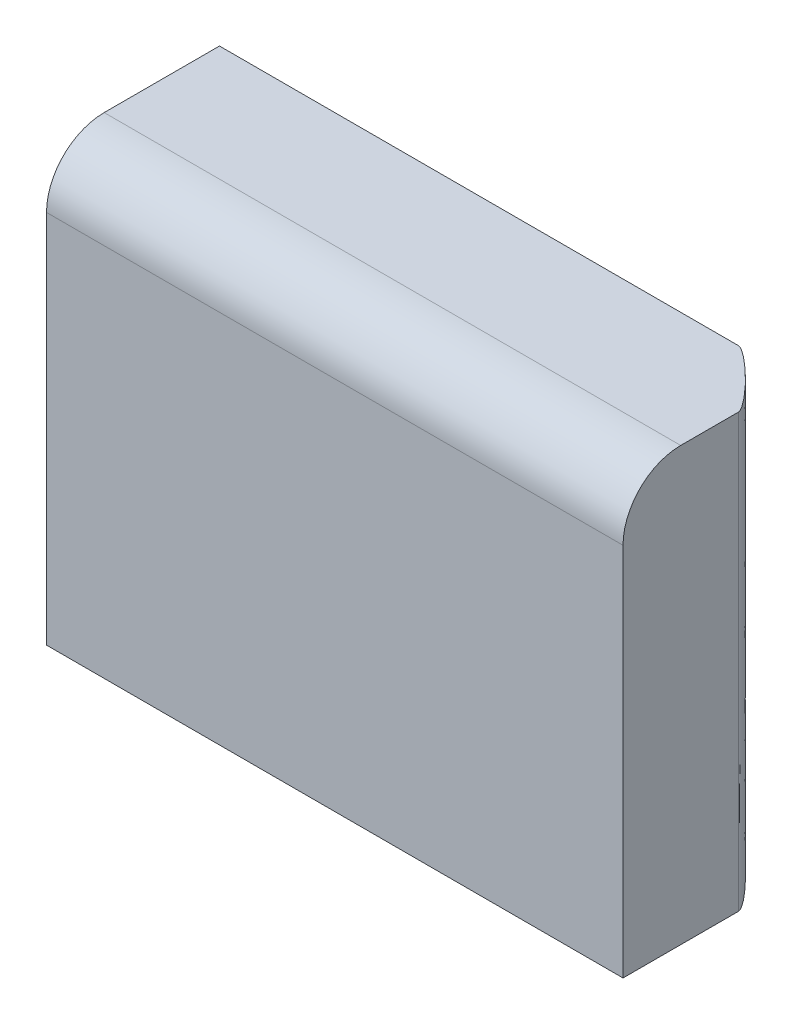
ISO-10303-21;
HEADER;
FILE_DESCRIPTION(('STEP AP214'),'2;1');
FILE_NAME('part.step','',(''),(''),'','','');
FILE_SCHEMA(('AUTOMOTIVE_DESIGN { 1 0 10303 214 1 1 1 1 }'));
ENDSEC;
DATA;
#1=APPLICATION_CONTEXT('core data for automotive mechanical design processes');
#2=APPLICATION_PROTOCOL_DEFINITION('international standard','automotive_design',2000,#1);
#3=PRODUCT_CONTEXT('',#1,'mechanical');
#4=PRODUCT('Part','Part','',(#3));
#5=PRODUCT_RELATED_PRODUCT_CATEGORY('part','',(#4));
#6=PRODUCT_DEFINITION_FORMATION('','',#4);
#7=PRODUCT_DEFINITION_CONTEXT('part definition',#1,'design');
#8=PRODUCT_DEFINITION('design','',#6,#7);
#9=PRODUCT_DEFINITION_SHAPE('','',#8);
#10=(LENGTH_UNIT() NAMED_UNIT(*) SI_UNIT(.MILLI.,.METRE.));
#11=(NAMED_UNIT(*) PLANE_ANGLE_UNIT() SI_UNIT($,.RADIAN.));
#12=(NAMED_UNIT(*) SI_UNIT($,.STERADIAN.) SOLID_ANGLE_UNIT());
#13=UNCERTAINTY_MEASURE_WITH_UNIT(LENGTH_MEASURE(1.E-05),#10,'distance_accuracy_value','');
#14=(GEOMETRIC_REPRESENTATION_CONTEXT(3) GLOBAL_UNCERTAINTY_ASSIGNED_CONTEXT((#13)) GLOBAL_UNIT_ASSIGNED_CONTEXT((#10,
#11,#12)) REPRESENTATION_CONTEXT('',''));
#15=CARTESIAN_POINT('',(0.,0.,0.));
#16=DIRECTION('',(0.,0.,1.));
#17=DIRECTION('',(1.,0.,0.));
#18=AXIS2_PLACEMENT_3D('',#15,#16,#17);
#19=CARTESIAN_POINT('',(10.,7.5,3.));
#20=DIRECTION('',(-1.,0.,0.));
#21=DIRECTION('',(0.,0.,1.));
#22=AXIS2_PLACEMENT_3D('',#19,#20,#21);
#23=PLANE('',#22);
#24=DIRECTION('',(0.,0.,-1.));
#25=VECTOR('',#24,1.);
#26=CARTESIAN_POINT('',(10.,-7.5,3.));
#27=LINE('',#26,#25);
#28=CARTESIAN_POINT('',(10.,-7.5,3.));
#29=VERTEX_POINT('',#28);
#30=CARTESIAN_POINT('',(10.,-7.5,-1.));
#31=VERTEX_POINT('',#30);
#32=EDGE_CURVE('E124',#29,#31,#27,.T.);
#33=ORIENTED_EDGE('',*,*,#32,.T.);
#34=CARTESIAN_POINT('',(10.,8.25,-1.));
#35=CARTESIAN_POINT('',(10.,2.75,-1.));
#36=CARTESIAN_POINT('',(10.,-2.75,-1.));
#37=CARTESIAN_POINT('',(10.,-8.25,-1.));
#38=(BOUNDED_CURVE() B_SPLINE_CURVE(3,(#34,#35,#36,#37),.UNSPECIFIED.,.F.,
.F.) B_SPLINE_CURVE_WITH_KNOTS((4,4),(-0.01575,0.000750000000000001),
.UNSPECIFIED.) CURVE() GEOMETRIC_REPRESENTATION_ITEM() RATIONAL_B_SPLINE_CURVE((1.,1.,1.,1.)) REPRESENTATION_ITEM(''));
#39=CARTESIAN_POINT('',(10.,7.5,-1.));
#40=VERTEX_POINT('',#39);
#41=EDGE_CURVE('E177',#31,#40,#38,.F.);
#42=ORIENTED_EDGE('',*,*,#41,.T.);
#43=DIRECTION('',(0.,0.,-1.));
#44=VECTOR('',#43,1.);
#45=CARTESIAN_POINT('',(10.,7.5,3.));
#46=LINE('',#45,#44);
#47=CARTESIAN_POINT('',(10.,7.5,1.));
#48=VERTEX_POINT('',#47);
#49=EDGE_CURVE('E184',#48,#40,#46,.T.);
#50=ORIENTED_EDGE('',*,*,#49,.F.);
#51=CARTESIAN_POINT('',(10.,5.5,1.));
#52=DIRECTION('',(-1.,0.,0.));
#53=DIRECTION('',(0.,0.,1.));
#54=AXIS2_PLACEMENT_3D('',#51,#52,#53);
#55=CIRCLE('',#54,2.);
#56=CARTESIAN_POINT('',(10.,5.5,3.));
#57=VERTEX_POINT('',#56);
#58=EDGE_CURVE('E174',#48,#57,#55,.F.);
#59=ORIENTED_EDGE('',*,*,#58,.T.);
#60=DIRECTION('',(0.,1.,0.));
#61=VECTOR('',#60,1.);
#62=CARTESIAN_POINT('',(10.,7.5,3.));
#63=LINE('',#62,#61);
#64=EDGE_CURVE('E114',#29,#57,#63,.T.);
#65=ORIENTED_EDGE('',*,*,#64,.F.);
#66=EDGE_LOOP('',(#33,#42,#50,#59,#65));
#67=FACE_BOUND('',#66,.T.);
#68=ADVANCED_FACE('F44',(#67),#23,.F.);
#69=CARTESIAN_POINT('',(-10.,7.5,3.));
#70=DIRECTION('',(0.,-1.,0.));
#71=DIRECTION('',(0.,0.,-1.));
#72=AXIS2_PLACEMENT_3D('',#69,#70,#71);
#73=PLANE('',#72);
#74=ORIENTED_EDGE('',*,*,#49,.T.);
#75=CARTESIAN_POINT('',(8.,7.5,-3.));
#76=CARTESIAN_POINT('',(10.,7.5,-3.));
#77=CARTESIAN_POINT('',(10.,7.5,-1.));
#78=(BOUNDED_CURVE() B_SPLINE_CURVE(2,(#75,#76,#77),.UNSPECIFIED.,.F.,
.F.) B_SPLINE_CURVE_WITH_KNOTS((3,3),(0.,1.),
.UNSPECIFIED.) CURVE() GEOMETRIC_REPRESENTATION_ITEM() RATIONAL_B_SPLINE_CURVE((1.,
0.14142135623731,1.)) REPRESENTATION_ITEM(''));
#79=CARTESIAN_POINT('',(8.,7.5,-3.));
#80=VERTEX_POINT('',#79);
#81=EDGE_CURVE('E73',#40,#80,#78,.F.);
#82=ORIENTED_EDGE('',*,*,#81,.T.);
#83=DIRECTION('',(-1.,0.,0.));
#84=VECTOR('',#83,1.);
#85=CARTESIAN_POINT('',(-10.,7.5,-3.));
#86=LINE('',#85,#84);
#87=CARTESIAN_POINT('',(-10.,7.5,-3.));
#88=VERTEX_POINT('',#87);
#89=EDGE_CURVE('E137',#80,#88,#86,.T.);
#90=ORIENTED_EDGE('',*,*,#89,.T.);
#91=DIRECTION('',(0.,0.,-1.));
#92=VECTOR('',#91,1.);
#93=CARTESIAN_POINT('',(-10.,7.5,3.));
#94=LINE('',#93,#92);
#95=CARTESIAN_POINT('',(-10.,7.5,1.));
#96=VERTEX_POINT('',#95);
#97=EDGE_CURVE('E123',#96,#88,#94,.T.);
#98=ORIENTED_EDGE('',*,*,#97,.F.);
#99=DIRECTION('',(-1.,0.,0.));
#100=VECTOR('',#99,1.);
#101=CARTESIAN_POINT('',(10.,7.5,1.));
#102=LINE('',#101,#100);
#103=EDGE_CURVE('E175',#96,#48,#102,.F.);
#104=ORIENTED_EDGE('',*,*,#103,.T.);
#105=EDGE_LOOP('',(#74,#82,#90,#98,#104));
#106=FACE_BOUND('',#105,.T.);
#107=ADVANCED_FACE('F149',(#106),#73,.F.);
#108=CARTESIAN_POINT('',(-10.,7.5,3.));
#109=DIRECTION('',(1.,0.,0.));
#110=DIRECTION('',(0.,1.,0.));
#111=AXIS2_PLACEMENT_3D('',#108,#109,#110);
#112=PLANE('',#111);
#113=DIRECTION('',(0.,-1.,0.));
#114=VECTOR('',#113,1.);
#115=CARTESIAN_POINT('',(-10.,7.5,3.));
#116=LINE('',#115,#114);
#117=CARTESIAN_POINT('',(-10.,5.5,3.));
#118=VERTEX_POINT('',#117);
#119=CARTESIAN_POINT('',(-10.,-7.5,3.));
#120=VERTEX_POINT('',#119);
#121=EDGE_CURVE('E104',#118,#120,#116,.T.);
#122=ORIENTED_EDGE('',*,*,#121,.F.);
#123=CARTESIAN_POINT('',(-10.,5.5,1.));
#124=DIRECTION('',(1.,0.,0.));
#125=DIRECTION('',(0.,1.,0.));
#126=AXIS2_PLACEMENT_3D('',#123,#124,#125);
#127=CIRCLE('',#126,2.);
#128=EDGE_CURVE('E180',#118,#96,#127,.F.);
#129=ORIENTED_EDGE('',*,*,#128,.T.);
#130=ORIENTED_EDGE('',*,*,#97,.T.);
#131=DIRECTION('',(0.,-1.,0.));
#132=VECTOR('',#131,1.);
#133=CARTESIAN_POINT('',(-10.,7.5,-3.));
#134=LINE('',#133,#132);
#135=CARTESIAN_POINT('',(-10.,-7.5,-3.));
#136=VERTEX_POINT('',#135);
#137=EDGE_CURVE('E121',#88,#136,#134,.T.);
#138=ORIENTED_EDGE('',*,*,#137,.T.);
#139=DIRECTION('',(0.,0.,-1.));
#140=VECTOR('',#139,1.);
#141=CARTESIAN_POINT('',(-10.,-7.5,3.));
#142=LINE('',#141,#140);
#143=EDGE_CURVE('E117',#120,#136,#142,.T.);
#144=ORIENTED_EDGE('',*,*,#143,.F.);
#145=EDGE_LOOP('',(#122,#129,#130,#138,#144));
#146=FACE_BOUND('',#145,.T.);
#147=ADVANCED_FACE('F118',(#146),#112,.F.);
#148=CARTESIAN_POINT('',(-10.,-7.5,3.));
#149=DIRECTION('',(0.,1.,0.));
#150=DIRECTION('',(0.,0.,1.));
#151=AXIS2_PLACEMENT_3D('',#148,#149,#150);
#152=PLANE('',#151);
#153=DIRECTION('',(1.,0.,0.));
#154=VECTOR('',#153,1.);
#155=CARTESIAN_POINT('',(-10.,-7.5,-3.));
#156=LINE('',#155,#154);
#157=CARTESIAN_POINT('',(8.,-7.5,-3.));
#158=VERTEX_POINT('',#157);
#159=EDGE_CURVE('E148',#136,#158,#156,.T.);
#160=ORIENTED_EDGE('',*,*,#159,.T.);
#161=CARTESIAN_POINT('',(10.,-7.5,-1.));
#162=CARTESIAN_POINT('',(10.,-7.5,-3.));
#163=CARTESIAN_POINT('',(8.,-7.5,-3.));
#164=(BOUNDED_CURVE() B_SPLINE_CURVE(2,(#161,#162,#163),.UNSPECIFIED.,.F.,
.F.) B_SPLINE_CURVE_WITH_KNOTS((3,3),(0.,1.),
.UNSPECIFIED.) CURVE() GEOMETRIC_REPRESENTATION_ITEM() RATIONAL_B_SPLINE_CURVE((1.,
0.141421356237309,1.)) REPRESENTATION_ITEM(''));
#165=EDGE_CURVE('E12',#158,#31,#164,.F.);
#166=ORIENTED_EDGE('',*,*,#165,.T.);
#167=ORIENTED_EDGE('',*,*,#32,.F.);
#168=DIRECTION('',(1.,0.,0.));
#169=VECTOR('',#168,1.);
#170=CARTESIAN_POINT('',(-10.,-7.5,3.));
#171=LINE('',#170,#169);
#172=EDGE_CURVE('E109',#120,#29,#171,.T.);
#173=ORIENTED_EDGE('',*,*,#172,.F.);
#174=ORIENTED_EDGE('',*,*,#143,.T.);
#175=EDGE_LOOP('',(#160,#166,#167,#173,#174));
#176=FACE_BOUND('',#175,.T.);
#177=ADVANCED_FACE('F126',(#176),#152,.F.);
#178=CARTESIAN_POINT('',(0.,0.,3.));
#179=DIRECTION('',(0.,0.,1.));
#180=DIRECTION('',(1.,0.,0.));
#181=AXIS2_PLACEMENT_3D('',#178,#179,#180);
#182=PLANE('',#181);
#183=ORIENTED_EDGE('',*,*,#64,.T.);
#184=DIRECTION('',(-1.,0.,0.));
#185=VECTOR('',#184,1.);
#186=CARTESIAN_POINT('',(-10.,5.5,3.));
#187=LINE('',#186,#185);
#188=EDGE_CURVE('E112',#57,#118,#187,.T.);
#189=ORIENTED_EDGE('',*,*,#188,.T.);
#190=ORIENTED_EDGE('',*,*,#121,.T.);
#191=ORIENTED_EDGE('',*,*,#172,.T.);
#192=EDGE_LOOP('',(#183,#189,#190,#191));
#193=FACE_BOUND('',#192,.T.);
#194=ADVANCED_FACE('F107',(#193),#182,.T.);
#195=CARTESIAN_POINT('',(0.,0.,-3.));
#196=DIRECTION('',(0.,0.,1.));
#197=DIRECTION('',(1.,0.,0.));
#198=AXIS2_PLACEMENT_3D('',#195,#196,#197);
#199=PLANE('',#198);
#200=ORIENTED_EDGE('',*,*,#89,.F.);
#201=CARTESIAN_POINT('',(8.,-8.25,-3.));
#202=CARTESIAN_POINT('',(8.,-2.75,-3.));
#203=CARTESIAN_POINT('',(8.,2.75,-3.));
#204=CARTESIAN_POINT('',(8.,8.25,-3.));
#205=(BOUNDED_CURVE() B_SPLINE_CURVE(3,(#201,#202,#203,#204),.UNSPECIFIED.,.F.,
.F.) B_SPLINE_CURVE_WITH_KNOTS((4,4),(-0.01575,0.00075),
.UNSPECIFIED.) CURVE() GEOMETRIC_REPRESENTATION_ITEM() RATIONAL_B_SPLINE_CURVE((1.,1.,1.,1.)) REPRESENTATION_ITEM(''));
#206=EDGE_CURVE('E58',#80,#158,#205,.F.);
#207=ORIENTED_EDGE('',*,*,#206,.T.);
#208=ORIENTED_EDGE('',*,*,#159,.F.);
#209=ORIENTED_EDGE('',*,*,#137,.F.);
#210=EDGE_LOOP('',(#200,#207,#208,#209));
#211=FACE_BOUND('',#210,.T.);
#212=ADVANCED_FACE('F164',(#211),#199,.F.);
#213=CARTESIAN_POINT('',(0.,5.5,1.));
#214=DIRECTION('',(1.,0.,0.));
#215=DIRECTION('',(0.,0.,-1.));
#216=AXIS2_PLACEMENT_3D('',#213,#214,#215);
#217=CYLINDRICAL_SURFACE('',#216,2.);
#218=ORIENTED_EDGE('',*,*,#58,.F.);
#219=ORIENTED_EDGE('',*,*,#103,.F.);
#220=ORIENTED_EDGE('',*,*,#128,.F.);
#221=ORIENTED_EDGE('',*,*,#188,.F.);
#222=EDGE_LOOP('',(#218,#219,#220,#221));
#223=FACE_BOUND('',#222,.T.);
#224=ADVANCED_FACE('F162',(#223),#217,.T.);
#225=CARTESIAN_POINT('',(10.,-8.25,-1.));
#226=CARTESIAN_POINT('',(10.,-2.75,-1.));
#227=CARTESIAN_POINT('',(10.,2.75,-1.));
#228=CARTESIAN_POINT('',(10.,8.25,-1.));
#229=CARTESIAN_POINT('',(10.,-8.25,-3.));
#230=CARTESIAN_POINT('',(10.,-2.75,-3.));
#231=CARTESIAN_POINT('',(10.,2.75,-3.));
#232=CARTESIAN_POINT('',(10.,8.25,-3.));
#233=CARTESIAN_POINT('',(8.,-8.25,-3.));
#234=CARTESIAN_POINT('',(8.,-2.75,-3.));
#235=CARTESIAN_POINT('',(8.,2.75,-3.));
#236=CARTESIAN_POINT('',(8.,8.25,-3.));
#237=(BOUNDED_SURFACE() B_SPLINE_SURFACE(2,3,((#225,#226,#227,#228),(#229,#230,#231,#232),(#233,
#234,#235,#236)),.UNSPECIFIED.,.F.,.F.,.F.) B_SPLINE_SURFACE_WITH_KNOTS((3,3),(4,4),(0.,1.),
(-0.01575,0.00075),
.UNSPECIFIED.) GEOMETRIC_REPRESENTATION_ITEM() RATIONAL_B_SPLINE_SURFACE(((1.,1.,1.,1.),
(0.14142135623731,0.14142135623731,0.14142135623731,0.14142135623731),(1.,1.,1.,1.))) REPRESENTATION_ITEM('') SURFACE());
#238=ORIENTED_EDGE('',*,*,#165,.F.);
#239=ORIENTED_EDGE('',*,*,#206,.F.);
#240=ORIENTED_EDGE('',*,*,#81,.F.);
#241=ORIENTED_EDGE('',*,*,#41,.F.);
#242=EDGE_LOOP('',(#238,#239,#240,#241));
#243=FACE_BOUND('',#242,.T.);
#244=ADVANCED_FACE('F47',(#243),#237,.T.);
#245=CLOSED_SHELL('',(#68,#107,#147,#177,#194,#212,#224,#244));
#246=MANIFOLD_SOLID_BREP('B2',#245);
#247=ADVANCED_BREP_SHAPE_REPRESENTATION('',(#18,#246),#14);
#248=SHAPE_DEFINITION_REPRESENTATION(#9,#247);
ENDSEC;
END-ISO-10303-21;
